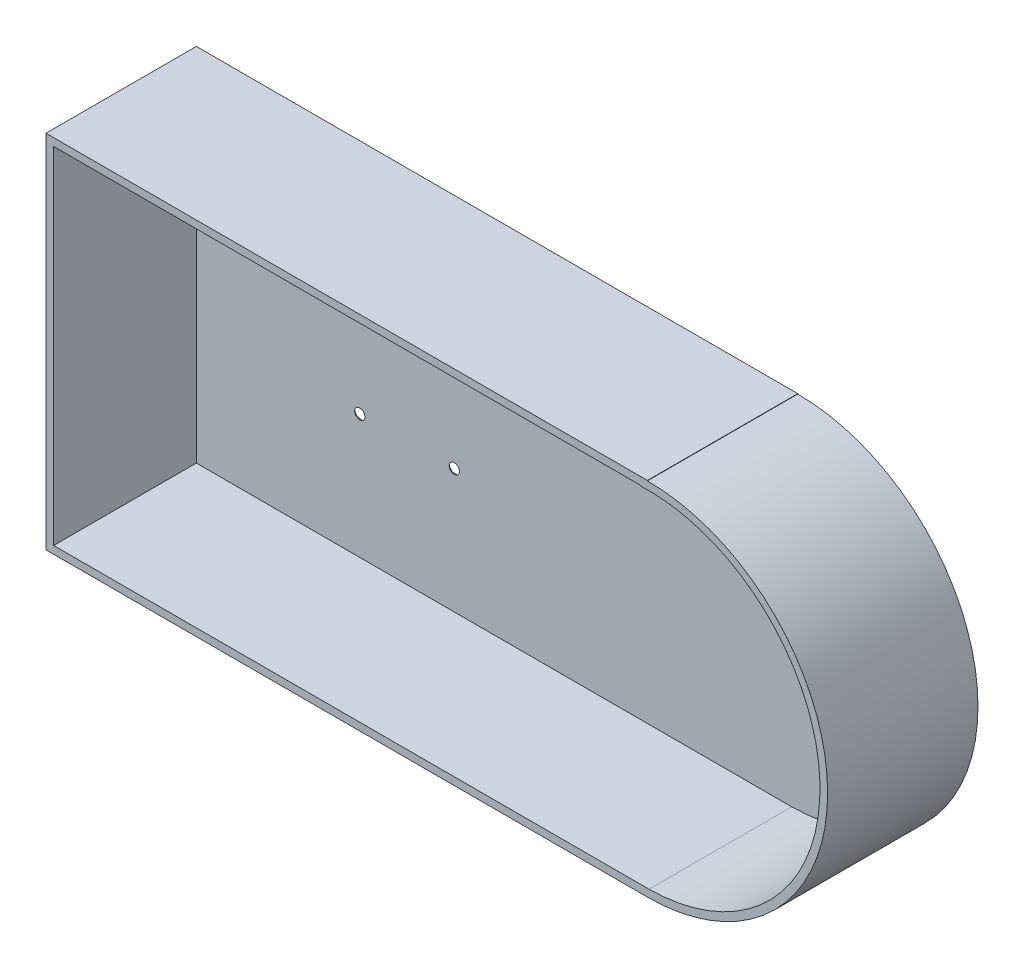
ISO-10303-21;
HEADER;
FILE_DESCRIPTION(('STEP AP214'),'2;1');
FILE_NAME('part.step','',(''),(''),'','','');
FILE_SCHEMA(('AUTOMOTIVE_DESIGN { 1 0 10303 214 1 1 1 1 }'));
ENDSEC;
DATA;
#1=APPLICATION_CONTEXT('core data for automotive mechanical design processes');
#2=APPLICATION_PROTOCOL_DEFINITION('international standard','automotive_design',2000,#1);
#3=PRODUCT_CONTEXT('',#1,'mechanical');
#4=PRODUCT('Part','Part','',(#3));
#5=PRODUCT_RELATED_PRODUCT_CATEGORY('part','',(#4));
#6=PRODUCT_DEFINITION_FORMATION('','',#4);
#7=PRODUCT_DEFINITION_CONTEXT('part definition',#1,'design');
#8=PRODUCT_DEFINITION('design','',#6,#7);
#9=PRODUCT_DEFINITION_SHAPE('','',#8);
#10=(LENGTH_UNIT() NAMED_UNIT(*) SI_UNIT(.MILLI.,.METRE.));
#11=(NAMED_UNIT(*) PLANE_ANGLE_UNIT() SI_UNIT($,.RADIAN.));
#12=(NAMED_UNIT(*) SI_UNIT($,.STERADIAN.) SOLID_ANGLE_UNIT());
#13=UNCERTAINTY_MEASURE_WITH_UNIT(LENGTH_MEASURE(1.E-05),#10,'distance_accuracy_value','');
#14=(GEOMETRIC_REPRESENTATION_CONTEXT(3) GLOBAL_UNCERTAINTY_ASSIGNED_CONTEXT((#13)) GLOBAL_UNIT_ASSIGNED_CONTEXT((#10,
#11,#12)) REPRESENTATION_CONTEXT('',''));
#15=CARTESIAN_POINT('',(0.,0.,0.));
#16=DIRECTION('',(0.,0.,1.));
#17=DIRECTION('',(1.,0.,0.));
#18=AXIS2_PLACEMENT_3D('',#15,#16,#17);
#19=CARTESIAN_POINT('',(-259.862068965517,163.448275862069,50.));
#20=DIRECTION('',(1.,0.,0.));
#21=DIRECTION('',(0.,0.,-1.));
#22=AXIS2_PLACEMENT_3D('',#19,#20,#21);
#23=PLANE('',#22);
#24=DIRECTION('',(0.,-1.,0.));
#25=VECTOR('',#24,1.);
#26=CARTESIAN_POINT('',(-259.862068965517,163.448275862069,0.));
#27=LINE('',#26,#25);
#28=CARTESIAN_POINT('',(-259.862068965517,163.448275862069,0.));
#29=VERTEX_POINT('',#28);
#30=CARTESIAN_POINT('',(-259.862068965517,43.448275862069,0.));
#31=VERTEX_POINT('',#30);
#32=EDGE_CURVE('E226',#29,#31,#27,.T.);
#33=ORIENTED_EDGE('',*,*,#32,.T.);
#34=DIRECTION('',(0.,0.,-1.));
#35=VECTOR('',#34,1.);
#36=CARTESIAN_POINT('',(-259.862068965517,43.448275862069,50.));
#37=LINE('',#36,#35);
#38=CARTESIAN_POINT('',(-259.862068965517,43.448275862069,50.));
#39=VERTEX_POINT('',#38);
#40=EDGE_CURVE('E11',#39,#31,#37,.T.);
#41=ORIENTED_EDGE('',*,*,#40,.F.);
#42=DIRECTION('',(0.,-1.,0.));
#43=VECTOR('',#42,1.);
#44=CARTESIAN_POINT('',(-259.862068965517,163.448275862069,50.));
#45=LINE('',#44,#43);
#46=CARTESIAN_POINT('',(-259.862068965517,163.448275862069,50.));
#47=VERTEX_POINT('',#46);
#48=EDGE_CURVE('E227',#47,#39,#45,.T.);
#49=ORIENTED_EDGE('',*,*,#48,.F.);
#50=DIRECTION('',(0.,0.,-1.));
#51=VECTOR('',#50,1.);
#52=CARTESIAN_POINT('',(-259.862068965517,163.448275862069,50.));
#53=LINE('',#52,#51);
#54=EDGE_CURVE('E244',#47,#29,#53,.T.);
#55=ORIENTED_EDGE('',*,*,#54,.T.);
#56=EDGE_LOOP('',(#33,#41,#49,#55));
#57=FACE_BOUND('',#56,.T.);
#58=ADVANCED_FACE('F35',(#57),#23,.F.);
#59=CARTESIAN_POINT('',(-259.862068965517,43.448275862069,50.));
#60=DIRECTION('',(0.,1.,0.));
#61=DIRECTION('',(0.,0.,1.));
#62=AXIS2_PLACEMENT_3D('',#59,#60,#61);
#63=PLANE('',#62);
#64=DIRECTION('',(1.,0.,0.));
#65=VECTOR('',#64,1.);
#66=CARTESIAN_POINT('',(-259.862068965517,43.448275862069,0.));
#67=LINE('',#66,#65);
#68=CARTESIAN_POINT('',(-59.8620689655171,43.448275862069,0.));
#69=VERTEX_POINT('',#68);
#70=EDGE_CURVE('E247',#31,#69,#67,.T.);
#71=ORIENTED_EDGE('',*,*,#70,.T.);
#72=DIRECTION('',(0.,0.,-1.));
#73=VECTOR('',#72,1.);
#74=CARTESIAN_POINT('',(-59.8620689655171,43.448275862069,50.));
#75=LINE('',#74,#73);
#76=CARTESIAN_POINT('',(-59.8620689655171,43.448275862069,50.));
#77=VERTEX_POINT('',#76);
#78=EDGE_CURVE('E42',#77,#69,#75,.T.);
#79=ORIENTED_EDGE('',*,*,#78,.F.);
#80=DIRECTION('',(1.,0.,0.));
#81=VECTOR('',#80,1.);
#82=CARTESIAN_POINT('',(-259.862068965517,43.448275862069,50.));
#83=LINE('',#82,#81);
#84=EDGE_CURVE('E230',#39,#77,#83,.T.);
#85=ORIENTED_EDGE('',*,*,#84,.F.);
#86=ORIENTED_EDGE('',*,*,#40,.T.);
#87=EDGE_LOOP('',(#71,#79,#85,#86));
#88=FACE_BOUND('',#87,.T.);
#89=ADVANCED_FACE('F273',(#88),#63,.F.);
#90=CARTESIAN_POINT('',(-59.8620689655171,43.4458163907795,50.));
#91=DIRECTION('',(-1.,0.,0.));
#92=DIRECTION('',(0.,0.,1.));
#93=AXIS2_PLACEMENT_3D('',#90,#91,#92);
#94=PLANE('',#93);
#95=DIRECTION('',(0.,1.,0.));
#96=VECTOR('',#95,1.);
#97=CARTESIAN_POINT('',(-59.8620689655171,43.4458163907795,0.));
#98=LINE('',#97,#96);
#99=CARTESIAN_POINT('',(-59.8620689655171,43.4458163907795,0.));
#100=VERTEX_POINT('',#99);
#101=EDGE_CURVE('E250',#100,#69,#98,.T.);
#102=ORIENTED_EDGE('',*,*,#101,.F.);
#103=DIRECTION('',(0.,0.,-1.));
#104=VECTOR('',#103,1.);
#105=CARTESIAN_POINT('',(-59.8620689655171,43.4458163907795,50.));
#106=LINE('',#105,#104);
#107=CARTESIAN_POINT('',(-59.8620689655171,43.4458163907795,50.));
#108=VERTEX_POINT('',#107);
#109=EDGE_CURVE('E266',#108,#100,#106,.T.);
#110=ORIENTED_EDGE('',*,*,#109,.F.);
#111=DIRECTION('',(0.,1.,0.));
#112=VECTOR('',#111,1.);
#113=CARTESIAN_POINT('',(-59.8620689655171,43.4458163907795,50.));
#114=LINE('',#113,#112);
#115=EDGE_CURVE('E233',#108,#77,#114,.T.);
#116=ORIENTED_EDGE('',*,*,#115,.T.);
#117=ORIENTED_EDGE('',*,*,#78,.T.);
#118=EDGE_LOOP('',(#102,#110,#116,#117));
#119=FACE_BOUND('',#118,.T.);
#120=ADVANCED_FACE('F270',(#119),#94,.T.);
#121=CARTESIAN_POINT('',(-59.8621742276257,103.387337740082,50.));
#122=DIRECTION('',(0.,0.,-1.));
#123=DIRECTION('',(-1.,0.,0.));
#124=AXIS2_PLACEMENT_3D('',#121,#122,#123);
#125=CYLINDRICAL_SURFACE('',#124,59.9415213493953);
#126=CARTESIAN_POINT('',(-59.8621742276257,103.387337740082,0.));
#127=DIRECTION('',(0.,0.,1.));
#128=DIRECTION('',(1.,0.,0.));
#129=AXIS2_PLACEMENT_3D('',#126,#127,#128);
#130=CIRCLE('',#129,59.9415213493953);
#131=CARTESIAN_POINT('',(-59.8620689655172,163.328859089385,0.));
#132=VERTEX_POINT('',#131);
#133=EDGE_CURVE('E253',#100,#132,#130,.T.);
#134=ORIENTED_EDGE('',*,*,#133,.T.);
#135=DIRECTION('',(0.,0.,-1.));
#136=VECTOR('',#135,1.);
#137=CARTESIAN_POINT('',(-59.8620689655172,163.328859089385,50.));
#138=LINE('',#137,#136);
#139=CARTESIAN_POINT('',(-59.8620689655172,163.328859089385,50.));
#140=VERTEX_POINT('',#139);
#141=EDGE_CURVE('E264',#140,#132,#138,.T.);
#142=ORIENTED_EDGE('',*,*,#141,.F.);
#143=CARTESIAN_POINT('',(-59.8621742276257,103.387337740082,50.));
#144=DIRECTION('',(0.,0.,1.));
#145=DIRECTION('',(1.,0.,0.));
#146=AXIS2_PLACEMENT_3D('',#143,#144,#145);
#147=CIRCLE('',#146,59.9415213493953);
#148=EDGE_CURVE('E236',#108,#140,#147,.T.);
#149=ORIENTED_EDGE('',*,*,#148,.F.);
#150=ORIENTED_EDGE('',*,*,#109,.T.);
#151=EDGE_LOOP('',(#134,#142,#149,#150));
#152=FACE_BOUND('',#151,.T.);
#153=ADVANCED_FACE('F282',(#152),#125,.T.);
#154=CARTESIAN_POINT('',(-59.8620689655172,163.448275862069,50.));
#155=DIRECTION('',(1.,0.,0.));
#156=DIRECTION('',(0.,0.,-1.));
#157=AXIS2_PLACEMENT_3D('',#154,#155,#156);
#158=PLANE('',#157);
#159=DIRECTION('',(0.,-1.,0.));
#160=VECTOR('',#159,1.);
#161=CARTESIAN_POINT('',(-59.8620689655172,163.448275862069,0.));
#162=LINE('',#161,#160);
#163=CARTESIAN_POINT('',(-59.8620689655172,163.448275862069,0.));
#164=VERTEX_POINT('',#163);
#165=EDGE_CURVE('E256',#164,#132,#162,.T.);
#166=ORIENTED_EDGE('',*,*,#165,.F.);
#167=DIRECTION('',(0.,0.,-1.));
#168=VECTOR('',#167,1.);
#169=CARTESIAN_POINT('',(-59.8620689655172,163.448275862069,50.));
#170=LINE('',#169,#168);
#171=CARTESIAN_POINT('',(-59.8620689655172,163.448275862069,50.));
#172=VERTEX_POINT('',#171);
#173=EDGE_CURVE('E262',#172,#164,#170,.T.);
#174=ORIENTED_EDGE('',*,*,#173,.F.);
#175=DIRECTION('',(0.,-1.,0.));
#176=VECTOR('',#175,1.);
#177=CARTESIAN_POINT('',(-59.8620689655172,163.448275862069,50.));
#178=LINE('',#177,#176);
#179=EDGE_CURVE('E238',#172,#140,#178,.T.);
#180=ORIENTED_EDGE('',*,*,#179,.T.);
#181=ORIENTED_EDGE('',*,*,#141,.T.);
#182=EDGE_LOOP('',(#166,#174,#180,#181));
#183=FACE_BOUND('',#182,.T.);
#184=ADVANCED_FACE('F294',(#183),#158,.T.);
#185=CARTESIAN_POINT('',(-259.862068965517,163.448275862069,50.));
#186=DIRECTION('',(0.,1.,0.));
#187=DIRECTION('',(0.,0.,1.));
#188=AXIS2_PLACEMENT_3D('',#185,#186,#187);
#189=PLANE('',#188);
#190=DIRECTION('',(1.,0.,0.));
#191=VECTOR('',#190,1.);
#192=CARTESIAN_POINT('',(-259.862068965517,163.448275862069,0.));
#193=LINE('',#192,#191);
#194=EDGE_CURVE('E231',#29,#164,#193,.T.);
#195=ORIENTED_EDGE('',*,*,#194,.F.);
#196=ORIENTED_EDGE('',*,*,#54,.F.);
#197=DIRECTION('',(1.,0.,0.));
#198=VECTOR('',#197,1.);
#199=CARTESIAN_POINT('',(-259.862068965517,163.448275862069,50.));
#200=LINE('',#199,#198);
#201=EDGE_CURVE('E241',#47,#172,#200,.T.);
#202=ORIENTED_EDGE('',*,*,#201,.T.);
#203=ORIENTED_EDGE('',*,*,#173,.T.);
#204=EDGE_LOOP('',(#195,#196,#202,#203));
#205=FACE_BOUND('',#204,.T.);
#206=ADVANCED_FACE('F292',(#205),#189,.T.);
#207=CARTESIAN_POINT('',(-59.8621742276257,103.387337740082,50.));
#208=DIRECTION('',(0.,0.,1.));
#209=DIRECTION('',(1.,0.,0.));
#210=AXIS2_PLACEMENT_3D('',#207,#208,#209);
#211=PLANE('',#210);
#212=DIRECTION('',(0.,-1.,0.));
#213=VECTOR('',#212,1.);
#214=CARTESIAN_POINT('',(-257.322068965517,163.448275862069,50.));
#215=LINE('',#214,#213);
#216=CARTESIAN_POINT('',(-257.322068965517,160.908275862069,50.));
#217=VERTEX_POINT('',#216);
#218=CARTESIAN_POINT('',(-257.322068965517,45.988275862069,50.));
#219=VERTEX_POINT('',#218);
#220=EDGE_CURVE('E215',#217,#219,#215,.T.);
#221=ORIENTED_EDGE('',*,*,#220,.F.);
#222=DIRECTION('',(1.,0.,0.));
#223=VECTOR('',#222,1.);
#224=CARTESIAN_POINT('',(-259.862068965517,160.908275862069,50.));
#225=LINE('',#224,#223);
#226=CARTESIAN_POINT('',(-62.4020689655172,160.908275862069,50.));
#227=VERTEX_POINT('',#226);
#228=EDGE_CURVE('E201',#217,#227,#225,.T.);
#229=ORIENTED_EDGE('',*,*,#228,.T.);
#230=DIRECTION('',(0.,-1.,0.));
#231=VECTOR('',#230,1.);
#232=CARTESIAN_POINT('',(-62.4020689655172,163.448275862069,50.));
#233=LINE('',#232,#231);
#234=CARTESIAN_POINT('',(-62.4020689655172,160.732639099004,50.));
#235=VERTEX_POINT('',#234);
#236=EDGE_CURVE('E57',#227,#235,#233,.T.);
#237=ORIENTED_EDGE('',*,*,#236,.T.);
#238=CARTESIAN_POINT('',(-59.8621742276257,103.387337740082,50.));
#239=DIRECTION('',(0.,0.,1.));
#240=DIRECTION('',(1.,0.,0.));
#241=AXIS2_PLACEMENT_3D('',#238,#239,#240);
#242=CIRCLE('',#241,57.4015213493953);
#243=CARTESIAN_POINT('',(-59.3308092409453,45.988275862069,50.));
#244=VERTEX_POINT('',#243);
#245=EDGE_CURVE('E220',#244,#235,#242,.T.);
#246=ORIENTED_EDGE('',*,*,#245,.F.);
#247=DIRECTION('',(1.,0.,0.));
#248=VECTOR('',#247,1.);
#249=CARTESIAN_POINT('',(-259.862068965517,45.988275862069,50.));
#250=LINE('',#249,#248);
#251=EDGE_CURVE('E217',#219,#244,#250,.T.);
#252=ORIENTED_EDGE('',*,*,#251,.F.);
#253=EDGE_LOOP('',(#221,#229,#237,#246,#252));
#254=FACE_BOUND('',#253,.T.);
#255=ORIENTED_EDGE('',*,*,#48,.T.);
#256=ORIENTED_EDGE('',*,*,#84,.T.);
#257=ORIENTED_EDGE('',*,*,#115,.F.);
#258=ORIENTED_EDGE('',*,*,#148,.T.);
#259=ORIENTED_EDGE('',*,*,#179,.F.);
#260=ORIENTED_EDGE('',*,*,#201,.F.);
#261=EDGE_LOOP('',(#255,#256,#257,#258,#259,#260));
#262=FACE_BOUND('',#261,.T.);
#263=ADVANCED_FACE('F286',(#254,#262),#211,.T.);
#264=CARTESIAN_POINT('',(-59.8621742276257,103.387337740082,0.));
#265=DIRECTION('',(0.,0.,1.));
#266=DIRECTION('',(1.,0.,0.));
#267=AXIS2_PLACEMENT_3D('',#264,#265,#266);
#268=PLANE('',#267);
#269=DIRECTION('',(-1.,0.,0.));
#270=VECTOR('',#269,1.);
#271=CARTESIAN_POINT('',(-167.286164268725,83.4482758620689,0.));
#272=LINE('',#271,#270);
#273=CARTESIAN_POINT('',(-167.286164268725,83.4482758620689,0.));
#274=VERTEX_POINT('',#273);
#275=CARTESIAN_POINT('',(-207.286164268725,83.4482758620689,0.));
#276=VERTEX_POINT('',#275);
#277=EDGE_CURVE('E174',#274,#276,#272,.T.);
#278=ORIENTED_EDGE('',*,*,#277,.F.);
#279=DIRECTION('',(0.,-1.,0.));
#280=VECTOR('',#279,1.);
#281=CARTESIAN_POINT('',(-167.286164268725,123.448275862069,0.));
#282=LINE('',#281,#280);
#283=CARTESIAN_POINT('',(-167.286164268725,123.448275862069,0.));
#284=VERTEX_POINT('',#283);
#285=EDGE_CURVE('E49',#284,#274,#282,.T.);
#286=ORIENTED_EDGE('',*,*,#285,.F.);
#287=DIRECTION('',(1.,0.,0.));
#288=VECTOR('',#287,1.);
#289=CARTESIAN_POINT('',(-167.286164268725,123.448275862069,0.));
#290=LINE('',#289,#288);
#291=CARTESIAN_POINT('',(-207.286164268725,123.448275862069,0.));
#292=VERTEX_POINT('',#291);
#293=EDGE_CURVE('E162',#292,#284,#290,.T.);
#294=ORIENTED_EDGE('',*,*,#293,.F.);
#295=DIRECTION('',(0.,1.,0.));
#296=VECTOR('',#295,1.);
#297=CARTESIAN_POINT('',(-207.286164268725,123.448275862069,0.));
#298=LINE('',#297,#296);
#299=EDGE_CURVE('E165',#276,#292,#298,.T.);
#300=ORIENTED_EDGE('',*,*,#299,.F.);
#301=EDGE_LOOP('',(#278,#286,#294,#300));
#302=FACE_BOUND('',#301,.T.);
#303=CARTESIAN_POINT('',(-75.4989196900901,103.730340091173,0.));
#304=DIRECTION('',(0.,0.,-1.));
#305=DIRECTION('',(-1.,0.,0.));
#306=AXIS2_PLACEMENT_3D('',#303,#304,#305);
#307=CIRCLE('',#306,45.);
#308=CARTESIAN_POINT('',(-120.49891969009,103.730340091173,0.));
#309=VERTEX_POINT('',#308);
#310=EDGE_CURVE('E180',#309,#309,#307,.T.);
#311=ORIENTED_EDGE('',*,*,#310,.F.);
#312=EDGE_LOOP('',(#311));
#313=FACE_BOUND('',#312,.T.);
#314=ORIENTED_EDGE('',*,*,#32,.F.);
#315=ORIENTED_EDGE('',*,*,#194,.T.);
#316=ORIENTED_EDGE('',*,*,#165,.T.);
#317=ORIENTED_EDGE('',*,*,#133,.F.);
#318=ORIENTED_EDGE('',*,*,#101,.T.);
#319=ORIENTED_EDGE('',*,*,#70,.F.);
#320=EDGE_LOOP('',(#314,#315,#316,#317,#318,#319));
#321=FACE_BOUND('',#320,.T.);
#322=ADVANCED_FACE('F278',(#302,#313,#321),#268,.F.);
#323=CARTESIAN_POINT('',(-257.322068965517,163.448275862069,50.));
#324=DIRECTION('',(1.,0.,0.));
#325=DIRECTION('',(0.,0.,-1.));
#326=AXIS2_PLACEMENT_3D('',#323,#324,#325);
#327=PLANE('',#326);
#328=DIRECTION('',(0.,-1.,0.));
#329=VECTOR('',#328,1.);
#330=CARTESIAN_POINT('',(-257.322068965517,163.448275862069,2.54));
#331=LINE('',#330,#329);
#332=CARTESIAN_POINT('',(-257.322068965517,160.908275862069,2.54));
#333=VERTEX_POINT('',#332);
#334=CARTESIAN_POINT('',(-257.322068965517,45.988275862069,2.54));
#335=VERTEX_POINT('',#334);
#336=EDGE_CURVE('E187',#333,#335,#331,.T.);
#337=ORIENTED_EDGE('',*,*,#336,.F.);
#338=DIRECTION('',(0.,0.,-1.));
#339=VECTOR('',#338,1.);
#340=CARTESIAN_POINT('',(-257.322068965517,160.908275862069,50.));
#341=LINE('',#340,#339);
#342=EDGE_CURVE('E198',#217,#333,#341,.T.);
#343=ORIENTED_EDGE('',*,*,#342,.F.);
#344=ORIENTED_EDGE('',*,*,#220,.T.);
#345=DIRECTION('',(0.,0.,-1.));
#346=VECTOR('',#345,1.);
#347=CARTESIAN_POINT('',(-257.322068965517,45.988275862069,50.));
#348=LINE('',#347,#346);
#349=EDGE_CURVE('E193',#219,#335,#348,.T.);
#350=ORIENTED_EDGE('',*,*,#349,.T.);
#351=EDGE_LOOP('',(#337,#343,#344,#350));
#352=FACE_BOUND('',#351,.T.);
#353=ADVANCED_FACE('F343',(#352),#327,.T.);
#354=CARTESIAN_POINT('',(-259.862068965517,45.988275862069,50.));
#355=DIRECTION('',(0.,1.,0.));
#356=DIRECTION('',(0.,0.,1.));
#357=AXIS2_PLACEMENT_3D('',#354,#355,#356);
#358=PLANE('',#357);
#359=DIRECTION('',(1.,0.,0.));
#360=VECTOR('',#359,1.);
#361=CARTESIAN_POINT('',(-259.862068965517,45.988275862069,2.54));
#362=LINE('',#361,#360);
#363=CARTESIAN_POINT('',(-59.3308092409453,45.988275862069,2.54));
#364=VERTEX_POINT('',#363);
#365=EDGE_CURVE('E192',#335,#364,#362,.T.);
#366=ORIENTED_EDGE('',*,*,#365,.F.);
#367=ORIENTED_EDGE('',*,*,#349,.F.);
#368=ORIENTED_EDGE('',*,*,#251,.T.);
#369=DIRECTION('',(0.,0.,-1.));
#370=VECTOR('',#369,1.);
#371=CARTESIAN_POINT('',(-59.3308092409453,45.988275862069,50.));
#372=LINE('',#371,#370);
#373=EDGE_CURVE('E196',#364,#244,#372,.F.);
#374=ORIENTED_EDGE('',*,*,#373,.F.);
#375=EDGE_LOOP('',(#366,#367,#368,#374));
#376=FACE_BOUND('',#375,.T.);
#377=ADVANCED_FACE('F348',(#376),#358,.T.);
#378=CARTESIAN_POINT('',(-59.8621742276257,103.387337740082,50.));
#379=DIRECTION('',(0.,0.,-1.));
#380=DIRECTION('',(-1.,0.,0.));
#381=AXIS2_PLACEMENT_3D('',#378,#379,#380);
#382=CYLINDRICAL_SURFACE('',#381,57.4015213493953);
#383=CARTESIAN_POINT('',(-59.8621742276257,103.387337740082,2.54));
#384=DIRECTION('',(0.,0.,1.));
#385=DIRECTION('',(1.,0.,0.));
#386=AXIS2_PLACEMENT_3D('',#383,#384,#385);
#387=CIRCLE('',#386,57.4015213493953);
#388=CARTESIAN_POINT('',(-62.4020689655172,160.732639099004,2.54));
#389=VERTEX_POINT('',#388);
#390=EDGE_CURVE('E204',#364,#389,#387,.T.);
#391=ORIENTED_EDGE('',*,*,#390,.F.);
#392=ORIENTED_EDGE('',*,*,#373,.T.);
#393=ORIENTED_EDGE('',*,*,#245,.T.);
#394=DIRECTION('',(0.,0.,-1.));
#395=VECTOR('',#394,1.);
#396=CARTESIAN_POINT('',(-62.4020689655172,160.732639099004,50.));
#397=LINE('',#396,#395);
#398=EDGE_CURVE('E197',#235,#389,#397,.T.);
#399=ORIENTED_EDGE('',*,*,#398,.T.);
#400=EDGE_LOOP('',(#391,#392,#393,#399));
#401=FACE_BOUND('',#400,.T.);
#402=ADVANCED_FACE('F358',(#401),#382,.F.);
#403=CARTESIAN_POINT('',(-62.4020689655172,163.448275862069,50.));
#404=DIRECTION('',(1.,0.,0.));
#405=DIRECTION('',(0.,0.,-1.));
#406=AXIS2_PLACEMENT_3D('',#403,#404,#405);
#407=PLANE('',#406);
#408=DIRECTION('',(0.,-1.,0.));
#409=VECTOR('',#408,1.);
#410=CARTESIAN_POINT('',(-62.4020689655172,163.448275862069,2.54));
#411=LINE('',#410,#409);
#412=CARTESIAN_POINT('',(-62.4020689655172,160.908275862069,2.54));
#413=VERTEX_POINT('',#412);
#414=EDGE_CURVE('E207',#413,#389,#411,.T.);
#415=ORIENTED_EDGE('',*,*,#414,.T.);
#416=ORIENTED_EDGE('',*,*,#398,.F.);
#417=ORIENTED_EDGE('',*,*,#236,.F.);
#418=DIRECTION('',(0.,0.,-1.));
#419=VECTOR('',#418,1.);
#420=CARTESIAN_POINT('',(-62.4020689655172,160.908275862069,50.));
#421=LINE('',#420,#419);
#422=EDGE_CURVE('E200',#227,#413,#421,.T.);
#423=ORIENTED_EDGE('',*,*,#422,.T.);
#424=EDGE_LOOP('',(#415,#416,#417,#423));
#425=FACE_BOUND('',#424,.T.);
#426=ADVANCED_FACE('F368',(#425),#407,.F.);
#427=CARTESIAN_POINT('',(-259.862068965517,160.908275862069,50.));
#428=DIRECTION('',(0.,1.,0.));
#429=DIRECTION('',(0.,0.,1.));
#430=AXIS2_PLACEMENT_3D('',#427,#428,#429);
#431=PLANE('',#430);
#432=DIRECTION('',(1.,0.,0.));
#433=VECTOR('',#432,1.);
#434=CARTESIAN_POINT('',(-259.862068965517,160.908275862069,2.54));
#435=LINE('',#434,#433);
#436=EDGE_CURVE('E211',#333,#413,#435,.T.);
#437=ORIENTED_EDGE('',*,*,#436,.T.);
#438=ORIENTED_EDGE('',*,*,#422,.F.);
#439=ORIENTED_EDGE('',*,*,#228,.F.);
#440=ORIENTED_EDGE('',*,*,#342,.T.);
#441=EDGE_LOOP('',(#437,#438,#439,#440));
#442=FACE_BOUND('',#441,.T.);
#443=ADVANCED_FACE('F378',(#442),#431,.F.);
#444=CARTESIAN_POINT('',(-59.8621742276257,103.387337740082,2.54));
#445=DIRECTION('',(0.,0.,1.));
#446=DIRECTION('',(1.,0.,0.));
#447=AXIS2_PLACEMENT_3D('',#444,#445,#446);
#448=PLANE('',#447);
#449=CARTESIAN_POINT('',(-72.6659800426013,104.296928020671,2.54));
#450=DIRECTION('',(0.,0.,1.));
#451=DIRECTION('',(1.,0.,0.));
#452=AXIS2_PLACEMENT_3D('',#449,#450,#451);
#453=CIRCLE('',#452,1.69999999999999);
#454=CARTESIAN_POINT('',(-70.9659800426013,104.296928020671,2.54));
#455=VERTEX_POINT('',#454);
#456=EDGE_CURVE('E526',#455,#455,#453,.T.);
#457=ORIENTED_EDGE('',*,*,#456,.F.);
#458=EDGE_LOOP('',(#457));
#459=FACE_BOUND('',#458,.T.);
#460=CARTESIAN_POINT('',(-171.535573739958,118.461626258115,2.54));
#461=DIRECTION('',(0.,0.,1.));
#462=DIRECTION('',(1.,0.,0.));
#463=AXIS2_PLACEMENT_3D('',#460,#461,#462);
#464=CIRCLE('',#463,1.69999999999999);
#465=CARTESIAN_POINT('',(-169.835573739958,118.461626258115,2.54));
#466=VERTEX_POINT('',#465);
#467=EDGE_CURVE('E536',#466,#466,#464,.T.);
#468=ORIENTED_EDGE('',*,*,#467,.F.);
#469=EDGE_LOOP('',(#468));
#470=FACE_BOUND('',#469,.T.);
#471=CARTESIAN_POINT('',(-202.981203827083,118.461626258115,2.54));
#472=DIRECTION('',(0.,0.,1.));
#473=DIRECTION('',(1.,0.,0.));
#474=AXIS2_PLACEMENT_3D('',#471,#472,#473);
#475=CIRCLE('',#474,1.69999999999999);
#476=CARTESIAN_POINT('',(-201.281203827083,118.461626258115,2.54));
#477=VERTEX_POINT('',#476);
#478=EDGE_CURVE('E542',#477,#477,#475,.T.);
#479=ORIENTED_EDGE('',*,*,#478,.F.);
#480=EDGE_LOOP('',(#479));
#481=FACE_BOUND('',#480,.T.);
#482=CARTESIAN_POINT('',(-202.981203827083,87.2992901357386,2.54));
#483=DIRECTION('',(0.,0.,1.));
#484=DIRECTION('',(1.,0.,0.));
#485=AXIS2_PLACEMENT_3D('',#482,#483,#484);
#486=CIRCLE('',#485,1.69999999999999);
#487=CARTESIAN_POINT('',(-201.281203827083,87.2992901357386,2.54));
#488=VERTEX_POINT('',#487);
#489=EDGE_CURVE('E548',#488,#488,#486,.T.);
#490=ORIENTED_EDGE('',*,*,#489,.F.);
#491=EDGE_LOOP('',(#490));
#492=FACE_BOUND('',#491,.T.);
#493=CARTESIAN_POINT('',(-171.535573739958,87.2992901357386,2.54));
#494=DIRECTION('',(0.,0.,1.));
#495=DIRECTION('',(1.,0.,0.));
#496=AXIS2_PLACEMENT_3D('',#493,#494,#495);
#497=CIRCLE('',#496,1.69999999999999);
#498=CARTESIAN_POINT('',(-169.835573739958,87.2992901357386,2.54));
#499=VERTEX_POINT('',#498);
#500=EDGE_CURVE('E168',#499,#499,#497,.T.);
#501=ORIENTED_EDGE('',*,*,#500,.F.);
#502=EDGE_LOOP('',(#501));
#503=FACE_BOUND('',#502,.T.);
#504=ORIENTED_EDGE('',*,*,#336,.T.);
#505=ORIENTED_EDGE('',*,*,#365,.T.);
#506=ORIENTED_EDGE('',*,*,#390,.T.);
#507=ORIENTED_EDGE('',*,*,#414,.F.);
#508=ORIENTED_EDGE('',*,*,#436,.F.);
#509=EDGE_LOOP('',(#504,#505,#506,#507,#508));
#510=FACE_BOUND('',#509,.T.);
#511=ADVANCED_FACE('F387',(#459,#470,#481,#492,#503,#510),#448,.T.);
#512=CARTESIAN_POINT('',(-75.4989196900901,103.730340091173,1.73999999999999));
#513=DIRECTION('',(0.,0.,-1.));
#514=DIRECTION('',(-1.,0.,0.));
#515=AXIS2_PLACEMENT_3D('',#512,#513,#514);
#516=CYLINDRICAL_SURFACE('',#515,45.);
#517=CARTESIAN_POINT('',(-75.4989196900901,103.730340091173,1.73999999999999));
#518=DIRECTION('',(0.,0.,-1.));
#519=DIRECTION('',(-1.,0.,0.));
#520=AXIS2_PLACEMENT_3D('',#517,#518,#519);
#521=CIRCLE('',#520,45.);
#522=CARTESIAN_POINT('',(-120.49891969009,103.730340091173,1.73999999999999));
#523=VERTEX_POINT('',#522);
#524=EDGE_CURVE('E184',#523,#523,#521,.T.);
#525=ORIENTED_EDGE('',*,*,#524,.F.);
#526=EDGE_LOOP('',(#525));
#527=FACE_BOUND('',#526,.T.);
#528=ORIENTED_EDGE('',*,*,#310,.T.);
#529=EDGE_LOOP('',(#528));
#530=FACE_BOUND('',#529,.T.);
#531=ADVANCED_FACE('F395',(#527,#530),#516,.F.);
#532=CARTESIAN_POINT('',(-75.4989196900901,103.730340091173,1.73999999999999));
#533=DIRECTION('',(0.,0.,-1.));
#534=DIRECTION('',(-1.,0.,0.));
#535=AXIS2_PLACEMENT_3D('',#532,#533,#534);
#536=PLANE('',#535);
#537=CARTESIAN_POINT('',(-72.6659800426013,104.296928020671,1.73999999999999));
#538=DIRECTION('',(0.,0.,-1.));
#539=DIRECTION('',(-1.,0.,0.));
#540=AXIS2_PLACEMENT_3D('',#537,#538,#539);
#541=CIRCLE('',#540,2.5);
#542=CARTESIAN_POINT('',(-75.1659800426013,104.296928020671,1.73999999999999));
#543=VERTEX_POINT('',#542);
#544=EDGE_CURVE('E529',#543,#543,#541,.T.);
#545=ORIENTED_EDGE('',*,*,#544,.F.);
#546=EDGE_LOOP('',(#545));
#547=FACE_BOUND('',#546,.T.);
#548=ORIENTED_EDGE('',*,*,#524,.T.);
#549=EDGE_LOOP('',(#548));
#550=FACE_BOUND('',#549,.T.);
#551=ADVANCED_FACE('F400',(#547,#550),#536,.T.);
#552=CARTESIAN_POINT('',(-167.286164268725,123.448275862069,1.73999999999999));
#553=DIRECTION('',(1.,0.,0.));
#554=DIRECTION('',(0.,0.,-1.));
#555=AXIS2_PLACEMENT_3D('',#552,#553,#554);
#556=PLANE('',#555);
#557=ORIENTED_EDGE('',*,*,#285,.T.);
#558=DIRECTION('',(0.,0.,-1.));
#559=VECTOR('',#558,1.);
#560=CARTESIAN_POINT('',(-167.286164268725,83.4482758620689,1.73999999999999));
#561=LINE('',#560,#559);
#562=CARTESIAN_POINT('',(-167.286164268725,83.4482758620689,1.73999999999999));
#563=VERTEX_POINT('',#562);
#564=EDGE_CURVE('E140',#563,#274,#561,.T.);
#565=ORIENTED_EDGE('',*,*,#564,.F.);
#566=DIRECTION('',(0.,-1.,0.));
#567=VECTOR('',#566,1.);
#568=CARTESIAN_POINT('',(-167.286164268725,123.448275862069,1.73999999999999));
#569=LINE('',#568,#567);
#570=CARTESIAN_POINT('',(-167.286164268725,123.448275862069,1.73999999999999));
#571=VERTEX_POINT('',#570);
#572=EDGE_CURVE('E144',#571,#563,#569,.T.);
#573=ORIENTED_EDGE('',*,*,#572,.F.);
#574=DIRECTION('',(0.,0.,-1.));
#575=VECTOR('',#574,1.);
#576=CARTESIAN_POINT('',(-167.286164268725,123.448275862069,1.73999999999999));
#577=LINE('',#576,#575);
#578=EDGE_CURVE('E178',#571,#284,#577,.T.);
#579=ORIENTED_EDGE('',*,*,#578,.T.);
#580=EDGE_LOOP('',(#557,#565,#573,#579));
#581=FACE_BOUND('',#580,.T.);
#582=ADVANCED_FACE('F142',(#581),#556,.F.);
#583=CARTESIAN_POINT('',(-167.286164268725,123.448275862069,1.73999999999999));
#584=DIRECTION('',(0.,1.,0.));
#585=DIRECTION('',(0.,0.,1.));
#586=AXIS2_PLACEMENT_3D('',#583,#584,#585);
#587=PLANE('',#586);
#588=ORIENTED_EDGE('',*,*,#293,.T.);
#589=ORIENTED_EDGE('',*,*,#578,.F.);
#590=DIRECTION('',(1.,0.,0.));
#591=VECTOR('',#590,1.);
#592=CARTESIAN_POINT('',(-167.286164268725,123.448275862069,1.73999999999999));
#593=LINE('',#592,#591);
#594=CARTESIAN_POINT('',(-207.286164268725,123.448275862069,1.73999999999999));
#595=VERTEX_POINT('',#594);
#596=EDGE_CURVE('E150',#595,#571,#593,.T.);
#597=ORIENTED_EDGE('',*,*,#596,.F.);
#598=DIRECTION('',(0.,0.,-1.));
#599=VECTOR('',#598,1.);
#600=CARTESIAN_POINT('',(-207.286164268725,123.448275862069,1.73999999999999));
#601=LINE('',#600,#599);
#602=EDGE_CURVE('E181',#595,#292,#601,.T.);
#603=ORIENTED_EDGE('',*,*,#602,.T.);
#604=EDGE_LOOP('',(#588,#589,#597,#603));
#605=FACE_BOUND('',#604,.T.);
#606=ADVANCED_FACE('F419',(#605),#587,.F.);
#607=CARTESIAN_POINT('',(-207.286164268725,123.448275862069,1.73999999999999));
#608=DIRECTION('',(-1.,0.,0.));
#609=DIRECTION('',(0.,-1.,0.));
#610=AXIS2_PLACEMENT_3D('',#607,#608,#609);
#611=PLANE('',#610);
#612=ORIENTED_EDGE('',*,*,#299,.T.);
#613=ORIENTED_EDGE('',*,*,#602,.F.);
#614=DIRECTION('',(0.,1.,0.));
#615=VECTOR('',#614,1.);
#616=CARTESIAN_POINT('',(-207.286164268725,123.448275862069,1.73999999999999));
#617=LINE('',#616,#615);
#618=CARTESIAN_POINT('',(-207.286164268725,83.4482758620689,1.73999999999999));
#619=VERTEX_POINT('',#618);
#620=EDGE_CURVE('E158',#619,#595,#617,.T.);
#621=ORIENTED_EDGE('',*,*,#620,.F.);
#622=DIRECTION('',(0.,0.,-1.));
#623=VECTOR('',#622,1.);
#624=CARTESIAN_POINT('',(-207.286164268725,83.4482758620689,1.73999999999999));
#625=LINE('',#624,#623);
#626=EDGE_CURVE('E149',#619,#276,#625,.T.);
#627=ORIENTED_EDGE('',*,*,#626,.T.);
#628=EDGE_LOOP('',(#612,#613,#621,#627));
#629=FACE_BOUND('',#628,.T.);
#630=ADVANCED_FACE('F428',(#629),#611,.F.);
#631=CARTESIAN_POINT('',(-167.286164268725,83.4482758620689,1.73999999999999));
#632=DIRECTION('',(0.,-1.,0.));
#633=DIRECTION('',(1.,0.,0.));
#634=AXIS2_PLACEMENT_3D('',#631,#632,#633);
#635=PLANE('',#634);
#636=ORIENTED_EDGE('',*,*,#277,.T.);
#637=ORIENTED_EDGE('',*,*,#626,.F.);
#638=DIRECTION('',(-1.,0.,0.));
#639=VECTOR('',#638,1.);
#640=CARTESIAN_POINT('',(-167.286164268725,83.4482758620689,1.73999999999999));
#641=LINE('',#640,#639);
#642=EDGE_CURVE('E153',#563,#619,#641,.T.);
#643=ORIENTED_EDGE('',*,*,#642,.F.);
#644=ORIENTED_EDGE('',*,*,#564,.T.);
#645=EDGE_LOOP('',(#636,#637,#643,#644));
#646=FACE_BOUND('',#645,.T.);
#647=ADVANCED_FACE('F154',(#646),#635,.F.);
#648=CARTESIAN_POINT('',(0.,0.,1.73999999999999));
#649=DIRECTION('',(0.,0.,-1.));
#650=DIRECTION('',(-1.,0.,0.));
#651=AXIS2_PLACEMENT_3D('',#648,#649,#650);
#652=PLANE('',#651);
#653=CARTESIAN_POINT('',(-171.535573739958,118.461626258115,1.73999999999999));
#654=DIRECTION('',(0.,0.,-1.));
#655=DIRECTION('',(-1.,0.,0.));
#656=AXIS2_PLACEMENT_3D('',#653,#654,#655);
#657=CIRCLE('',#656,2.5);
#658=CARTESIAN_POINT('',(-174.035573739958,118.461626258115,1.73999999999999));
#659=VERTEX_POINT('',#658);
#660=EDGE_CURVE('E531',#659,#659,#657,.T.);
#661=ORIENTED_EDGE('',*,*,#660,.F.);
#662=EDGE_LOOP('',(#661));
#663=FACE_BOUND('',#662,.T.);
#664=CARTESIAN_POINT('',(-202.981203827083,118.461626258115,1.73999999999999));
#665=DIRECTION('',(0.,0.,-1.));
#666=DIRECTION('',(-1.,0.,0.));
#667=AXIS2_PLACEMENT_3D('',#664,#665,#666);
#668=CIRCLE('',#667,2.5);
#669=CARTESIAN_POINT('',(-205.481203827083,118.461626258115,1.73999999999999));
#670=VERTEX_POINT('',#669);
#671=EDGE_CURVE('E539',#670,#670,#668,.T.);
#672=ORIENTED_EDGE('',*,*,#671,.F.);
#673=EDGE_LOOP('',(#672));
#674=FACE_BOUND('',#673,.T.);
#675=CARTESIAN_POINT('',(-202.981203827083,87.2992901357386,1.73999999999999));
#676=DIRECTION('',(0.,0.,-1.));
#677=DIRECTION('',(-1.,0.,0.));
#678=AXIS2_PLACEMENT_3D('',#675,#676,#677);
#679=CIRCLE('',#678,2.5);
#680=CARTESIAN_POINT('',(-205.481203827083,87.2992901357386,1.73999999999999));
#681=VERTEX_POINT('',#680);
#682=EDGE_CURVE('E545',#681,#681,#679,.T.);
#683=ORIENTED_EDGE('',*,*,#682,.F.);
#684=EDGE_LOOP('',(#683));
#685=FACE_BOUND('',#684,.T.);
#686=CARTESIAN_POINT('',(-171.535573739958,87.2992901357386,1.73999999999999));
#687=DIRECTION('',(0.,0.,-1.));
#688=DIRECTION('',(-1.,0.,0.));
#689=AXIS2_PLACEMENT_3D('',#686,#687,#688);
#690=CIRCLE('',#689,2.5);
#691=CARTESIAN_POINT('',(-174.035573739958,87.2992901357386,1.73999999999999));
#692=VERTEX_POINT('',#691);
#693=EDGE_CURVE('E550',#692,#692,#690,.T.);
#694=ORIENTED_EDGE('',*,*,#693,.F.);
#695=EDGE_LOOP('',(#694));
#696=FACE_BOUND('',#695,.T.);
#697=ORIENTED_EDGE('',*,*,#572,.T.);
#698=ORIENTED_EDGE('',*,*,#642,.T.);
#699=ORIENTED_EDGE('',*,*,#620,.T.);
#700=ORIENTED_EDGE('',*,*,#596,.T.);
#701=EDGE_LOOP('',(#697,#698,#699,#700));
#702=FACE_BOUND('',#701,.T.);
#703=ADVANCED_FACE('F160',(#663,#674,#685,#696,#702),#652,.T.);
#704=CARTESIAN_POINT('',(-171.535573739958,87.2992901357386,1.73999999999999));
#705=DIRECTION('',(0.,0.,-1.));
#706=DIRECTION('',(-1.,0.,0.));
#707=AXIS2_PLACEMENT_3D('',#704,#705,#706);
#708=CONICAL_SURFACE('',#707,2.5,0.785398163397449);
#709=ORIENTED_EDGE('',*,*,#500,.T.);
#710=EDGE_LOOP('',(#709));
#711=FACE_BOUND('',#710,.T.);
#712=ORIENTED_EDGE('',*,*,#693,.T.);
#713=EDGE_LOOP('',(#712));
#714=FACE_BOUND('',#713,.T.);
#715=ADVANCED_FACE('F469',(#711,#714),#708,.F.);
#716=CARTESIAN_POINT('',(-202.981203827083,87.2992901357386,1.73999999999999));
#717=DIRECTION('',(0.,0.,-1.));
#718=DIRECTION('',(-1.,0.,0.));
#719=AXIS2_PLACEMENT_3D('',#716,#717,#718);
#720=CONICAL_SURFACE('',#719,2.5,0.785398163397449);
#721=ORIENTED_EDGE('',*,*,#489,.T.);
#722=EDGE_LOOP('',(#721));
#723=FACE_BOUND('',#722,.T.);
#724=ORIENTED_EDGE('',*,*,#682,.T.);
#725=EDGE_LOOP('',(#724));
#726=FACE_BOUND('',#725,.T.);
#727=ADVANCED_FACE('F479',(#723,#726),#720,.F.);
#728=CARTESIAN_POINT('',(-202.981203827083,118.461626258115,1.73999999999999));
#729=DIRECTION('',(0.,0.,-1.));
#730=DIRECTION('',(-1.,0.,0.));
#731=AXIS2_PLACEMENT_3D('',#728,#729,#730);
#732=CONICAL_SURFACE('',#731,2.5,0.785398163397449);
#733=ORIENTED_EDGE('',*,*,#478,.T.);
#734=EDGE_LOOP('',(#733));
#735=FACE_BOUND('',#734,.T.);
#736=ORIENTED_EDGE('',*,*,#671,.T.);
#737=EDGE_LOOP('',(#736));
#738=FACE_BOUND('',#737,.T.);
#739=ADVANCED_FACE('F489',(#735,#738),#732,.F.);
#740=CARTESIAN_POINT('',(-171.535573739958,118.461626258115,1.73999999999999));
#741=DIRECTION('',(0.,0.,-1.));
#742=DIRECTION('',(-1.,0.,0.));
#743=AXIS2_PLACEMENT_3D('',#740,#741,#742);
#744=CONICAL_SURFACE('',#743,2.5,0.785398163397449);
#745=ORIENTED_EDGE('',*,*,#467,.T.);
#746=EDGE_LOOP('',(#745));
#747=FACE_BOUND('',#746,.T.);
#748=ORIENTED_EDGE('',*,*,#660,.T.);
#749=EDGE_LOOP('',(#748));
#750=FACE_BOUND('',#749,.T.);
#751=ADVANCED_FACE('F499',(#747,#750),#744,.F.);
#752=CARTESIAN_POINT('',(-72.6659800426013,104.296928020671,1.73999999999999));
#753=DIRECTION('',(0.,0.,-1.));
#754=DIRECTION('',(-1.,0.,0.));
#755=AXIS2_PLACEMENT_3D('',#752,#753,#754);
#756=CONICAL_SURFACE('',#755,2.5,0.785398163397449);
#757=ORIENTED_EDGE('',*,*,#456,.T.);
#758=EDGE_LOOP('',(#757));
#759=FACE_BOUND('',#758,.T.);
#760=ORIENTED_EDGE('',*,*,#544,.T.);
#761=EDGE_LOOP('',(#760));
#762=FACE_BOUND('',#761,.T.);
#763=ADVANCED_FACE('F509',(#759,#762),#756,.F.);
#764=CLOSED_SHELL('',(#58,#89,#120,#153,#184,#206,#263,#322,#353,#377,#402,#426,#443,#511,#531,
#551,#582,#606,#630,#647,#703,#715,#727,#739,#751,#763));
#765=MANIFOLD_SOLID_BREP('B2',#764);
#766=ADVANCED_BREP_SHAPE_REPRESENTATION('',(#18,#765),#14);
#767=SHAPE_DEFINITION_REPRESENTATION(#9,#766);
ENDSEC;
END-ISO-10303-21;
